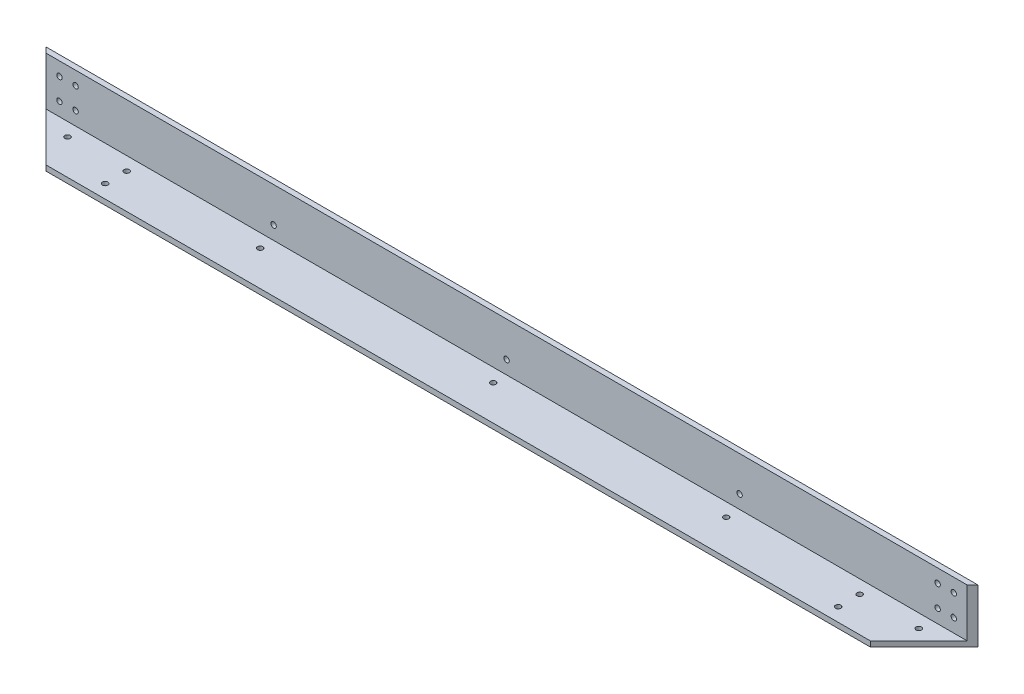
ISO-10303-21;
HEADER;
FILE_DESCRIPTION(('STEP AP214'),'2;1');
FILE_NAME('part.step','',(''),(''),'','','');
FILE_SCHEMA(('AUTOMOTIVE_DESIGN { 1 0 10303 214 1 1 1 1 }'));
ENDSEC;
DATA;
#1=APPLICATION_CONTEXT('core data for automotive mechanical design processes');
#2=APPLICATION_PROTOCOL_DEFINITION('international standard','automotive_design',2000,#1);
#3=PRODUCT_CONTEXT('',#1,'mechanical');
#4=PRODUCT('Part','Part','',(#3));
#5=PRODUCT_RELATED_PRODUCT_CATEGORY('part','',(#4));
#6=PRODUCT_DEFINITION_FORMATION('','',#4);
#7=PRODUCT_DEFINITION_CONTEXT('part definition',#1,'design');
#8=PRODUCT_DEFINITION('design','',#6,#7);
#9=PRODUCT_DEFINITION_SHAPE('','',#8);
#10=(LENGTH_UNIT() NAMED_UNIT(*) SI_UNIT(.MILLI.,.METRE.));
#11=(NAMED_UNIT(*) PLANE_ANGLE_UNIT() SI_UNIT($,.RADIAN.));
#12=(NAMED_UNIT(*) SI_UNIT($,.STERADIAN.) SOLID_ANGLE_UNIT());
#13=UNCERTAINTY_MEASURE_WITH_UNIT(LENGTH_MEASURE(1.E-05),#10,'distance_accuracy_value','');
#14=(GEOMETRIC_REPRESENTATION_CONTEXT(3) GLOBAL_UNCERTAINTY_ASSIGNED_CONTEXT((#13)) GLOBAL_UNIT_ASSIGNED_CONTEXT((#10,
#11,#12)) REPRESENTATION_CONTEXT('',''));
#15=CARTESIAN_POINT('',(0.,0.,0.));
#16=DIRECTION('',(0.,0.,1.));
#17=DIRECTION('',(1.,0.,0.));
#18=AXIS2_PLACEMENT_3D('',#15,#16,#17);
#19=CARTESIAN_POINT('',(550.,31.75,0.));
#20=DIRECTION('',(0.,0.,1.));
#21=DIRECTION('',(0.,-1.,0.));
#22=AXIS2_PLACEMENT_3D('',#19,#20,#21);
#23=PLANE('',#22);
#24=CARTESIAN_POINT('',(20.6375,11.1125,0.));
#25=DIRECTION('',(0.,0.,1.));
#26=DIRECTION('',(1.,0.,0.));
#27=AXIS2_PLACEMENT_3D('',#24,#25,#26);
#28=CIRCLE('',#27,1.5875);
#29=CARTESIAN_POINT('',(22.225,11.1125,0.));
#30=VERTEX_POINT('',#29);
#31=EDGE_CURVE('E305',#30,#30,#28,.T.);
#32=ORIENTED_EDGE('',*,*,#31,.T.);
#33=EDGE_LOOP('',(#32));
#34=FACE_BOUND('',#33,.T.);
#35=CARTESIAN_POINT('',(529.3625,11.1125,0.));
#36=DIRECTION('',(0.,0.,1.));
#37=DIRECTION('',(1.,0.,0.));
#38=AXIS2_PLACEMENT_3D('',#35,#36,#37);
#39=CIRCLE('',#38,1.58750000000005);
#40=CARTESIAN_POINT('',(530.95,11.1125,0.));
#41=VERTEX_POINT('',#40);
#42=EDGE_CURVE('E295',#41,#41,#39,.T.);
#43=ORIENTED_EDGE('',*,*,#42,.T.);
#44=EDGE_LOOP('',(#43));
#45=FACE_BOUND('',#44,.T.);
#46=CARTESIAN_POINT('',(538.8875,11.1125,0.));
#47=DIRECTION('',(0.,0.,1.));
#48=DIRECTION('',(1.,0.,0.));
#49=AXIS2_PLACEMENT_3D('',#46,#47,#48);
#50=CIRCLE('',#49,1.58750000000005);
#51=CARTESIAN_POINT('',(540.475,11.1125,0.));
#52=VERTEX_POINT('',#51);
#53=EDGE_CURVE('E296',#52,#52,#50,.T.);
#54=ORIENTED_EDGE('',*,*,#53,.T.);
#55=EDGE_LOOP('',(#54));
#56=FACE_BOUND('',#55,.T.);
#57=CARTESIAN_POINT('',(137.5,11.1125,0.));
#58=DIRECTION('',(0.,0.,1.));
#59=DIRECTION('',(1.,0.,0.));
#60=AXIS2_PLACEMENT_3D('',#57,#58,#59);
#61=CIRCLE('',#60,1.58749999999998);
#62=CARTESIAN_POINT('',(139.0875,11.1125,0.));
#63=VERTEX_POINT('',#62);
#64=EDGE_CURVE('E279',#63,#63,#61,.T.);
#65=ORIENTED_EDGE('',*,*,#64,.T.);
#66=EDGE_LOOP('',(#65));
#67=FACE_BOUND('',#66,.T.);
#68=CARTESIAN_POINT('',(11.1125,11.1125,0.));
#69=DIRECTION('',(0.,0.,1.));
#70=DIRECTION('',(1.,0.,0.));
#71=AXIS2_PLACEMENT_3D('',#68,#69,#70);
#72=CIRCLE('',#71,1.5875);
#73=CARTESIAN_POINT('',(12.7,11.1125,0.));
#74=VERTEX_POINT('',#73);
#75=EDGE_CURVE('E304',#74,#74,#72,.T.);
#76=ORIENTED_EDGE('',*,*,#75,.T.);
#77=EDGE_LOOP('',(#76));
#78=FACE_BOUND('',#77,.T.);
#79=CARTESIAN_POINT('',(20.6375,23.8125,0.));
#80=DIRECTION('',(0.,0.,1.));
#81=DIRECTION('',(1.,0.,0.));
#82=AXIS2_PLACEMENT_3D('',#79,#80,#81);
#83=CIRCLE('',#82,1.5875);
#84=CARTESIAN_POINT('',(22.225,23.8125,0.));
#85=VERTEX_POINT('',#84);
#86=EDGE_CURVE('E328',#85,#85,#83,.T.);
#87=ORIENTED_EDGE('',*,*,#86,.T.);
#88=EDGE_LOOP('',(#87));
#89=FACE_BOUND('',#88,.T.);
#90=CARTESIAN_POINT('',(529.3625,23.8125,0.));
#91=DIRECTION('',(0.,0.,1.));
#92=DIRECTION('',(1.,0.,0.));
#93=AXIS2_PLACEMENT_3D('',#90,#91,#92);
#94=CIRCLE('',#93,1.58750000000005);
#95=CARTESIAN_POINT('',(530.95,23.8125,0.));
#96=VERTEX_POINT('',#95);
#97=EDGE_CURVE('E322',#96,#96,#94,.T.);
#98=ORIENTED_EDGE('',*,*,#97,.T.);
#99=EDGE_LOOP('',(#98));
#100=FACE_BOUND('',#99,.T.);
#101=CARTESIAN_POINT('',(538.8875,23.8125,0.));
#102=DIRECTION('',(0.,0.,1.));
#103=DIRECTION('',(1.,0.,0.));
#104=AXIS2_PLACEMENT_3D('',#101,#102,#103);
#105=CIRCLE('',#104,1.58750000000005);
#106=CARTESIAN_POINT('',(540.475,23.8125,0.));
#107=VERTEX_POINT('',#106);
#108=EDGE_CURVE('E316',#107,#107,#105,.T.);
#109=ORIENTED_EDGE('',*,*,#108,.T.);
#110=EDGE_LOOP('',(#109));
#111=FACE_BOUND('',#110,.T.);
#112=CARTESIAN_POINT('',(275.,11.1125,0.));
#113=DIRECTION('',(0.,0.,1.));
#114=DIRECTION('',(1.,0.,0.));
#115=AXIS2_PLACEMENT_3D('',#112,#113,#114);
#116=CIRCLE('',#115,1.58750000000004);
#117=CARTESIAN_POINT('',(276.5875,11.1125,0.));
#118=VERTEX_POINT('',#117);
#119=EDGE_CURVE('E274',#118,#118,#116,.T.);
#120=ORIENTED_EDGE('',*,*,#119,.T.);
#121=EDGE_LOOP('',(#120));
#122=FACE_BOUND('',#121,.T.);
#123=CARTESIAN_POINT('',(412.5,11.1125,0.));
#124=DIRECTION('',(0.,0.,1.));
#125=DIRECTION('',(1.,0.,0.));
#126=AXIS2_PLACEMENT_3D('',#123,#124,#125);
#127=CIRCLE('',#126,1.58750000000004);
#128=CARTESIAN_POINT('',(414.0875,11.1125,0.));
#129=VERTEX_POINT('',#128);
#130=EDGE_CURVE('E289',#129,#129,#127,.T.);
#131=ORIENTED_EDGE('',*,*,#130,.T.);
#132=EDGE_LOOP('',(#131));
#133=FACE_BOUND('',#132,.T.);
#134=CARTESIAN_POINT('',(11.1125,23.8125,0.));
#135=DIRECTION('',(0.,0.,1.));
#136=DIRECTION('',(1.,0.,0.));
#137=AXIS2_PLACEMENT_3D('',#134,#135,#136);
#138=CIRCLE('',#137,1.5875);
#139=CARTESIAN_POINT('',(12.7,23.8125,0.));
#140=VERTEX_POINT('',#139);
#141=EDGE_CURVE('E336',#140,#140,#138,.T.);
#142=ORIENTED_EDGE('',*,*,#141,.T.);
#143=EDGE_LOOP('',(#142));
#144=FACE_BOUND('',#143,.T.);
#145=DIRECTION('',(0.,1.,0.));
#146=VECTOR('',#145,1.);
#147=CARTESIAN_POINT('',(0.,31.75,0.));
#148=LINE('',#147,#146);
#149=CARTESIAN_POINT('',(0.,0.,0.));
#150=VERTEX_POINT('',#149);
#151=CARTESIAN_POINT('',(0.,31.75,0.));
#152=VERTEX_POINT('',#151);
#153=EDGE_CURVE('E107',#150,#152,#148,.T.);
#154=ORIENTED_EDGE('',*,*,#153,.T.);
#155=DIRECTION('',(-1.,0.,0.));
#156=VECTOR('',#155,1.);
#157=CARTESIAN_POINT('',(550.,31.75,0.));
#158=LINE('',#157,#156);
#159=CARTESIAN_POINT('',(550.,31.75,0.));
#160=VERTEX_POINT('',#159);
#161=EDGE_CURVE('E93',#160,#152,#158,.T.);
#162=ORIENTED_EDGE('',*,*,#161,.F.);
#163=DIRECTION('',(0.,1.,0.));
#164=VECTOR('',#163,1.);
#165=CARTESIAN_POINT('',(550.,31.75,0.));
#166=LINE('',#165,#164);
#167=CARTESIAN_POINT('',(550.,0.,0.));
#168=VERTEX_POINT('',#167);
#169=EDGE_CURVE('E105',#168,#160,#166,.T.);
#170=ORIENTED_EDGE('',*,*,#169,.F.);
#171=DIRECTION('',(-1.,0.,0.));
#172=VECTOR('',#171,1.);
#173=CARTESIAN_POINT('',(550.,0.,0.));
#174=LINE('',#173,#172);
#175=EDGE_CURVE('E114',#168,#150,#174,.T.);
#176=ORIENTED_EDGE('',*,*,#175,.T.);
#177=EDGE_LOOP('',(#154,#162,#170,#176));
#178=FACE_BOUND('',#177,.T.);
#179=ADVANCED_FACE('F38',(#34,#45,#56,#67,#78,#89,#100,#111,#122,#133,#144,#178),#23,.F.);
#180=CARTESIAN_POINT('',(550.,31.75,3.17499999999997));
#181=DIRECTION('',(0.,-1.,0.));
#182=DIRECTION('',(0.,0.,-1.));
#183=AXIS2_PLACEMENT_3D('',#180,#181,#182);
#184=PLANE('',#183);
#185=ORIENTED_EDGE('',*,*,#161,.T.);
#186=DIRECTION('',(0.707106781186547,0.,0.707106781186548));
#187=VECTOR('',#186,1.);
#188=CARTESIAN_POINT('',(31.7499999999999,31.75,31.75));
#189=LINE('',#188,#187);
#190=CARTESIAN_POINT('',(3.17499999999993,31.75,3.17499999999997));
#191=VERTEX_POINT('',#190);
#192=EDGE_CURVE('E61',#152,#191,#189,.T.);
#193=ORIENTED_EDGE('',*,*,#192,.T.);
#194=DIRECTION('',(-1.,0.,0.));
#195=VECTOR('',#194,1.);
#196=CARTESIAN_POINT('',(550.,31.75,3.17499999999997));
#197=LINE('',#196,#195);
#198=CARTESIAN_POINT('',(546.825,31.75,3.17499999999997));
#199=VERTEX_POINT('',#198);
#200=EDGE_CURVE('E95',#199,#191,#197,.T.);
#201=ORIENTED_EDGE('',*,*,#200,.F.);
#202=DIRECTION('',(-0.707106781186548,0.,0.707106781186547));
#203=VECTOR('',#202,1.);
#204=CARTESIAN_POINT('',(550.,31.75,0.));
#205=LINE('',#204,#203);
#206=EDGE_CURVE('E90',#199,#160,#205,.F.);
#207=ORIENTED_EDGE('',*,*,#206,.T.);
#208=EDGE_LOOP('',(#185,#193,#201,#207));
#209=FACE_BOUND('',#208,.T.);
#210=ADVANCED_FACE('F92',(#209),#184,.F.);
#211=CARTESIAN_POINT('',(550.,3.17499999999996,3.175));
#212=DIRECTION('',(0.,0.,-1.));
#213=DIRECTION('',(0.,1.,0.));
#214=AXIS2_PLACEMENT_3D('',#211,#212,#213);
#215=PLANE('',#214);
#216=CARTESIAN_POINT('',(20.6375,11.1125,3.17500000000001));
#217=DIRECTION('',(0.,0.,1.));
#218=DIRECTION('',(1.,0.,0.));
#219=AXIS2_PLACEMENT_3D('',#216,#217,#218);
#220=CIRCLE('',#219,1.5875);
#221=CARTESIAN_POINT('',(22.225,11.1125,3.17500000000001));
#222=VERTEX_POINT('',#221);
#223=EDGE_CURVE('E301',#222,#222,#220,.T.);
#224=ORIENTED_EDGE('',*,*,#223,.F.);
#225=EDGE_LOOP('',(#224));
#226=FACE_BOUND('',#225,.T.);
#227=CARTESIAN_POINT('',(529.3625,11.1125,3.17500000000001));
#228=DIRECTION('',(0.,0.,1.));
#229=DIRECTION('',(1.,0.,0.));
#230=AXIS2_PLACEMENT_3D('',#227,#228,#229);
#231=CIRCLE('',#230,1.58750000000005);
#232=CARTESIAN_POINT('',(530.95,11.1125,3.17500000000001));
#233=VERTEX_POINT('',#232);
#234=EDGE_CURVE('E307',#233,#233,#231,.T.);
#235=ORIENTED_EDGE('',*,*,#234,.F.);
#236=EDGE_LOOP('',(#235));
#237=FACE_BOUND('',#236,.T.);
#238=CARTESIAN_POINT('',(538.8875,11.1125,3.17500000000001));
#239=DIRECTION('',(0.,0.,1.));
#240=DIRECTION('',(1.,0.,0.));
#241=AXIS2_PLACEMENT_3D('',#238,#239,#240);
#242=CIRCLE('',#241,1.58750000000005);
#243=CARTESIAN_POINT('',(540.475,11.1125,3.17500000000001));
#244=VERTEX_POINT('',#243);
#245=EDGE_CURVE('E292',#244,#244,#242,.T.);
#246=ORIENTED_EDGE('',*,*,#245,.F.);
#247=EDGE_LOOP('',(#246));
#248=FACE_BOUND('',#247,.T.);
#249=CARTESIAN_POINT('',(137.5,11.1125,3.17500000000001));
#250=DIRECTION('',(0.,0.,1.));
#251=DIRECTION('',(1.,0.,0.));
#252=AXIS2_PLACEMENT_3D('',#249,#250,#251);
#253=CIRCLE('',#252,1.58749999999998);
#254=CARTESIAN_POINT('',(139.0875,11.1125,3.17500000000001));
#255=VERTEX_POINT('',#254);
#256=EDGE_CURVE('E282',#255,#255,#253,.T.);
#257=ORIENTED_EDGE('',*,*,#256,.F.);
#258=EDGE_LOOP('',(#257));
#259=FACE_BOUND('',#258,.T.);
#260=CARTESIAN_POINT('',(11.1125,11.1125,3.17500000000001));
#261=DIRECTION('',(0.,0.,1.));
#262=DIRECTION('',(1.,0.,0.));
#263=AXIS2_PLACEMENT_3D('',#260,#261,#262);
#264=CIRCLE('',#263,1.5875);
#265=CARTESIAN_POINT('',(12.7,11.1125,3.17500000000001));
#266=VERTEX_POINT('',#265);
#267=EDGE_CURVE('E331',#266,#266,#264,.T.);
#268=ORIENTED_EDGE('',*,*,#267,.F.);
#269=EDGE_LOOP('',(#268));
#270=FACE_BOUND('',#269,.T.);
#271=CARTESIAN_POINT('',(20.6375,23.8125,3.17500000000001));
#272=DIRECTION('',(0.,0.,1.));
#273=DIRECTION('',(1.,0.,0.));
#274=AXIS2_PLACEMENT_3D('',#271,#272,#273);
#275=CIRCLE('',#274,1.5875);
#276=CARTESIAN_POINT('',(22.225,23.8125,3.17500000000001));
#277=VERTEX_POINT('',#276);
#278=EDGE_CURVE('E325',#277,#277,#275,.T.);
#279=ORIENTED_EDGE('',*,*,#278,.F.);
#280=EDGE_LOOP('',(#279));
#281=FACE_BOUND('',#280,.T.);
#282=CARTESIAN_POINT('',(529.3625,23.8125,3.17500000000001));
#283=DIRECTION('',(0.,0.,1.));
#284=DIRECTION('',(1.,0.,0.));
#285=AXIS2_PLACEMENT_3D('',#282,#283,#284);
#286=CIRCLE('',#285,1.58750000000005);
#287=CARTESIAN_POINT('',(530.95,23.8125,3.17500000000001));
#288=VERTEX_POINT('',#287);
#289=EDGE_CURVE('E319',#288,#288,#286,.T.);
#290=ORIENTED_EDGE('',*,*,#289,.F.);
#291=EDGE_LOOP('',(#290));
#292=FACE_BOUND('',#291,.T.);
#293=CARTESIAN_POINT('',(538.8875,23.8125,3.17500000000001));
#294=DIRECTION('',(0.,0.,1.));
#295=DIRECTION('',(1.,0.,0.));
#296=AXIS2_PLACEMENT_3D('',#293,#294,#295);
#297=CIRCLE('',#296,1.58750000000005);
#298=CARTESIAN_POINT('',(540.475,23.8125,3.17500000000001));
#299=VERTEX_POINT('',#298);
#300=EDGE_CURVE('E312',#299,#299,#297,.T.);
#301=ORIENTED_EDGE('',*,*,#300,.F.);
#302=EDGE_LOOP('',(#301));
#303=FACE_BOUND('',#302,.T.);
#304=CARTESIAN_POINT('',(275.,11.1125,3.17500000000001));
#305=DIRECTION('',(0.,0.,1.));
#306=DIRECTION('',(1.,0.,0.));
#307=AXIS2_PLACEMENT_3D('',#304,#305,#306);
#308=CIRCLE('',#307,1.58750000000004);
#309=CARTESIAN_POINT('',(276.5875,11.1125,3.17500000000001));
#310=VERTEX_POINT('',#309);
#311=EDGE_CURVE('E277',#310,#310,#308,.T.);
#312=ORIENTED_EDGE('',*,*,#311,.F.);
#313=EDGE_LOOP('',(#312));
#314=FACE_BOUND('',#313,.T.);
#315=CARTESIAN_POINT('',(412.5,11.1125,3.17500000000001));
#316=DIRECTION('',(0.,0.,1.));
#317=DIRECTION('',(1.,0.,0.));
#318=AXIS2_PLACEMENT_3D('',#315,#316,#317);
#319=CIRCLE('',#318,1.58750000000004);
#320=CARTESIAN_POINT('',(414.0875,11.1125,3.17500000000001));
#321=VERTEX_POINT('',#320);
#322=EDGE_CURVE('E284',#321,#321,#319,.T.);
#323=ORIENTED_EDGE('',*,*,#322,.F.);
#324=EDGE_LOOP('',(#323));
#325=FACE_BOUND('',#324,.T.);
#326=CARTESIAN_POINT('',(11.1125,23.8125,3.17500000000001));
#327=DIRECTION('',(0.,0.,1.));
#328=DIRECTION('',(1.,0.,0.));
#329=AXIS2_PLACEMENT_3D('',#326,#327,#328);
#330=CIRCLE('',#329,1.5875);
#331=CARTESIAN_POINT('',(12.7,23.8125,3.17500000000001));
#332=VERTEX_POINT('',#331);
#333=EDGE_CURVE('E315',#332,#332,#330,.T.);
#334=ORIENTED_EDGE('',*,*,#333,.F.);
#335=EDGE_LOOP('',(#334));
#336=FACE_BOUND('',#335,.T.);
#337=ORIENTED_EDGE('',*,*,#200,.T.);
#338=DIRECTION('',(0.,-1.,0.));
#339=VECTOR('',#338,1.);
#340=CARTESIAN_POINT('',(3.17500000000003,0.,3.17500000000001));
#341=LINE('',#340,#339);
#342=CARTESIAN_POINT('',(3.17500000000004,3.17499999999996,3.175));
#343=VERTEX_POINT('',#342);
#344=EDGE_CURVE('E47',#191,#343,#341,.T.);
#345=ORIENTED_EDGE('',*,*,#344,.T.);
#346=DIRECTION('',(-1.,0.,0.));
#347=VECTOR('',#346,1.);
#348=CARTESIAN_POINT('',(550.,3.17499999999996,3.175));
#349=LINE('',#348,#347);
#350=CARTESIAN_POINT('',(546.825,3.17499999999996,3.175));
#351=VERTEX_POINT('',#350);
#352=EDGE_CURVE('E129',#351,#343,#349,.T.);
#353=ORIENTED_EDGE('',*,*,#352,.F.);
#354=DIRECTION('',(0.,-1.,0.));
#355=VECTOR('',#354,1.);
#356=CARTESIAN_POINT('',(546.825,0.,3.17500000000001));
#357=LINE('',#356,#355);
#358=EDGE_CURVE('E100',#351,#199,#357,.F.);
#359=ORIENTED_EDGE('',*,*,#358,.T.);
#360=EDGE_LOOP('',(#337,#345,#353,#359));
#361=FACE_BOUND('',#360,.T.);
#362=ADVANCED_FACE('F153',(#226,#237,#248,#259,#270,#281,#292,#303,#314,#325,#336,#361),#215,.F.);
#363=CARTESIAN_POINT('',(550.,3.17499999999996,31.75));
#364=DIRECTION('',(0.,-1.,0.));
#365=DIRECTION('',(0.,0.,-1.));
#366=AXIS2_PLACEMENT_3D('',#363,#364,#365);
#367=PLANE('',#366);
#368=CARTESIAN_POINT('',(275.,3.17499999999996,11.1125));
#369=DIRECTION('',(0.,1.,0.));
#370=DIRECTION('',(0.,0.,1.));
#371=AXIS2_PLACEMENT_3D('',#368,#369,#370);
#372=CIRCLE('',#371,1.58750000000004);
#373=CARTESIAN_POINT('',(275.,3.17499999999996,12.7));
#374=VERTEX_POINT('',#373);
#375=EDGE_CURVE('E366',#374,#374,#372,.T.);
#376=ORIENTED_EDGE('',*,*,#375,.F.);
#377=EDGE_LOOP('',(#376));
#378=FACE_BOUND('',#377,.T.);
#379=CARTESIAN_POINT('',(412.5,3.17499999999996,11.1125));
#380=DIRECTION('',(0.,1.,0.));
#381=DIRECTION('',(0.,0.,1.));
#382=AXIS2_PLACEMENT_3D('',#379,#380,#381);
#383=CIRCLE('',#382,1.58750000000004);
#384=CARTESIAN_POINT('',(412.5,3.17499999999996,12.7));
#385=VERTEX_POINT('',#384);
#386=EDGE_CURVE('E371',#385,#385,#383,.T.);
#387=ORIENTED_EDGE('',*,*,#386,.F.);
#388=EDGE_LOOP('',(#387));
#389=FACE_BOUND('',#388,.T.);
#390=CARTESIAN_POINT('',(491.2625,3.17499999999996,23.8125));
#391=DIRECTION('',(0.,1.,0.));
#392=DIRECTION('',(0.,0.,1.));
#393=AXIS2_PLACEMENT_3D('',#390,#391,#392);
#394=CIRCLE('',#393,1.58750000000004);
#395=CARTESIAN_POINT('',(491.2625,3.17499999999996,25.4));
#396=VERTEX_POINT('',#395);
#397=EDGE_CURVE('E377',#396,#396,#394,.T.);
#398=ORIENTED_EDGE('',*,*,#397,.F.);
#399=EDGE_LOOP('',(#398));
#400=FACE_BOUND('',#399,.T.);
#401=CARTESIAN_POINT('',(491.2625,3.17499999999996,11.1125));
#402=DIRECTION('',(0.,1.,0.));
#403=DIRECTION('',(0.,0.,1.));
#404=AXIS2_PLACEMENT_3D('',#401,#402,#403);
#405=CIRCLE('',#404,1.58750000000004);
#406=CARTESIAN_POINT('',(491.2625,3.17499999999996,12.7));
#407=VERTEX_POINT('',#406);
#408=EDGE_CURVE('E383',#407,#407,#405,.T.);
#409=ORIENTED_EDGE('',*,*,#408,.F.);
#410=EDGE_LOOP('',(#409));
#411=FACE_BOUND('',#410,.T.);
#412=CARTESIAN_POINT('',(23.8125,3.17499999999996,11.1125));
#413=DIRECTION('',(0.,1.,0.));
#414=DIRECTION('',(0.,0.,1.));
#415=AXIS2_PLACEMENT_3D('',#412,#413,#414);
#416=CIRCLE('',#415,1.5875);
#417=CARTESIAN_POINT('',(23.8125,3.17499999999996,12.7));
#418=VERTEX_POINT('',#417);
#419=EDGE_CURVE('E349',#418,#418,#416,.T.);
#420=ORIENTED_EDGE('',*,*,#419,.F.);
#421=EDGE_LOOP('',(#420));
#422=FACE_BOUND('',#421,.T.);
#423=CARTESIAN_POINT('',(526.1875,3.17499999999996,11.1125));
#424=DIRECTION('',(0.,1.,0.));
#425=DIRECTION('',(0.,0.,1.));
#426=AXIS2_PLACEMENT_3D('',#423,#424,#425);
#427=CIRCLE('',#426,1.58750000000005);
#428=CARTESIAN_POINT('',(526.1875,3.17499999999996,12.7));
#429=VERTEX_POINT('',#428);
#430=EDGE_CURVE('E342',#429,#429,#427,.T.);
#431=ORIENTED_EDGE('',*,*,#430,.F.);
#432=EDGE_LOOP('',(#431));
#433=FACE_BOUND('',#432,.T.);
#434=CARTESIAN_POINT('',(58.7375,3.17499999999996,11.1125));
#435=DIRECTION('',(0.,1.,0.));
#436=DIRECTION('',(0.,0.,1.));
#437=AXIS2_PLACEMENT_3D('',#434,#435,#436);
#438=CIRCLE('',#437,1.5875);
#439=CARTESIAN_POINT('',(58.7375,3.17499999999996,12.7));
#440=VERTEX_POINT('',#439);
#441=EDGE_CURVE('E361',#440,#440,#438,.T.);
#442=ORIENTED_EDGE('',*,*,#441,.F.);
#443=EDGE_LOOP('',(#442));
#444=FACE_BOUND('',#443,.T.);
#445=CARTESIAN_POINT('',(58.7375,3.17499999999996,23.8125));
#446=DIRECTION('',(0.,1.,0.));
#447=DIRECTION('',(0.,0.,1.));
#448=AXIS2_PLACEMENT_3D('',#445,#446,#447);
#449=CIRCLE('',#448,1.58749999999998);
#450=CARTESIAN_POINT('',(58.7375,3.17499999999996,25.4));
#451=VERTEX_POINT('',#450);
#452=EDGE_CURVE('E354',#451,#451,#449,.T.);
#453=ORIENTED_EDGE('',*,*,#452,.F.);
#454=EDGE_LOOP('',(#453));
#455=FACE_BOUND('',#454,.T.);
#456=CARTESIAN_POINT('',(137.5,3.17499999999996,11.1125));
#457=DIRECTION('',(0.,1.,0.));
#458=DIRECTION('',(0.,0.,1.));
#459=AXIS2_PLACEMENT_3D('',#456,#457,#458);
#460=CIRCLE('',#459,1.58749999999998);
#461=CARTESIAN_POINT('',(137.5,3.17499999999996,12.7));
#462=VERTEX_POINT('',#461);
#463=EDGE_CURVE('E121',#462,#462,#460,.T.);
#464=ORIENTED_EDGE('',*,*,#463,.F.);
#465=EDGE_LOOP('',(#464));
#466=FACE_BOUND('',#465,.T.);
#467=ORIENTED_EDGE('',*,*,#352,.T.);
#468=DIRECTION('',(0.707106781186547,0.,0.707106781186548));
#469=VECTOR('',#468,1.);
#470=CARTESIAN_POINT('',(31.7499999999999,3.17499999999996,31.75));
#471=LINE('',#470,#469);
#472=CARTESIAN_POINT('',(31.7499999999999,3.17499999999996,31.75));
#473=VERTEX_POINT('',#472);
#474=EDGE_CURVE('E11',#343,#473,#471,.T.);
#475=ORIENTED_EDGE('',*,*,#474,.T.);
#476=DIRECTION('',(-1.,0.,0.));
#477=VECTOR('',#476,1.);
#478=CARTESIAN_POINT('',(550.,3.17499999999996,31.75));
#479=LINE('',#478,#477);
#480=CARTESIAN_POINT('',(518.25,3.17499999999996,31.75));
#481=VERTEX_POINT('',#480);
#482=EDGE_CURVE('E126',#481,#473,#479,.T.);
#483=ORIENTED_EDGE('',*,*,#482,.F.);
#484=DIRECTION('',(-0.707106781186548,0.,0.707106781186547));
#485=VECTOR('',#484,1.);
#486=CARTESIAN_POINT('',(550.,3.17499999999996,0.));
#487=LINE('',#486,#485);
#488=EDGE_CURVE('E135',#481,#351,#487,.F.);
#489=ORIENTED_EDGE('',*,*,#488,.T.);
#490=EDGE_LOOP('',(#467,#475,#483,#489));
#491=FACE_BOUND('',#490,.T.);
#492=ADVANCED_FACE('F150',(#378,#389,#400,#411,#422,#433,#444,#455,#466,#491),#367,.F.);
#493=CARTESIAN_POINT('',(550.,0.,31.75));
#494=DIRECTION('',(0.,0.,-1.));
#495=DIRECTION('',(-1.,0.,0.));
#496=AXIS2_PLACEMENT_3D('',#493,#494,#495);
#497=PLANE('',#496);
#498=ORIENTED_EDGE('',*,*,#482,.T.);
#499=DIRECTION('',(0.,-1.,0.));
#500=VECTOR('',#499,1.);
#501=CARTESIAN_POINT('',(31.7499999999999,0.,31.75));
#502=LINE('',#501,#500);
#503=CARTESIAN_POINT('',(31.7499999999999,0.,31.75));
#504=VERTEX_POINT('',#503);
#505=EDGE_CURVE('E99',#473,#504,#502,.T.);
#506=ORIENTED_EDGE('',*,*,#505,.T.);
#507=DIRECTION('',(-1.,0.,0.));
#508=VECTOR('',#507,1.);
#509=CARTESIAN_POINT('',(550.,0.,31.75));
#510=LINE('',#509,#508);
#511=CARTESIAN_POINT('',(518.25,0.,31.75));
#512=VERTEX_POINT('',#511);
#513=EDGE_CURVE('E116',#512,#504,#510,.T.);
#514=ORIENTED_EDGE('',*,*,#513,.F.);
#515=DIRECTION('',(0.,1.,0.));
#516=VECTOR('',#515,1.);
#517=CARTESIAN_POINT('',(518.25,0.,31.75));
#518=LINE('',#517,#516);
#519=EDGE_CURVE('E133',#512,#481,#518,.T.);
#520=ORIENTED_EDGE('',*,*,#519,.T.);
#521=EDGE_LOOP('',(#498,#506,#514,#520));
#522=FACE_BOUND('',#521,.T.);
#523=ADVANCED_FACE('F152',(#522),#497,.F.);
#524=CARTESIAN_POINT('',(550.,0.,0.));
#525=DIRECTION('',(0.,1.,0.));
#526=DIRECTION('',(0.,0.,1.));
#527=AXIS2_PLACEMENT_3D('',#524,#525,#526);
#528=PLANE('',#527);
#529=CARTESIAN_POINT('',(275.,0.,11.1125));
#530=DIRECTION('',(0.,1.,0.));
#531=DIRECTION('',(0.,0.,1.));
#532=AXIS2_PLACEMENT_3D('',#529,#530,#531);
#533=CIRCLE('',#532,1.58750000000004);
#534=CARTESIAN_POINT('',(275.,0.,12.7));
#535=VERTEX_POINT('',#534);
#536=EDGE_CURVE('E369',#535,#535,#533,.T.);
#537=ORIENTED_EDGE('',*,*,#536,.T.);
#538=EDGE_LOOP('',(#537));
#539=FACE_BOUND('',#538,.T.);
#540=CARTESIAN_POINT('',(412.5,0.,11.1125));
#541=DIRECTION('',(0.,1.,0.));
#542=DIRECTION('',(0.,0.,1.));
#543=AXIS2_PLACEMENT_3D('',#540,#541,#542);
#544=CIRCLE('',#543,1.58750000000004);
#545=CARTESIAN_POINT('',(412.5,0.,12.7));
#546=VERTEX_POINT('',#545);
#547=EDGE_CURVE('E374',#546,#546,#544,.T.);
#548=ORIENTED_EDGE('',*,*,#547,.T.);
#549=EDGE_LOOP('',(#548));
#550=FACE_BOUND('',#549,.T.);
#551=CARTESIAN_POINT('',(491.2625,0.,23.8125));
#552=DIRECTION('',(0.,1.,0.));
#553=DIRECTION('',(0.,0.,1.));
#554=AXIS2_PLACEMENT_3D('',#551,#552,#553);
#555=CIRCLE('',#554,1.58750000000004);
#556=CARTESIAN_POINT('',(491.2625,0.,25.4));
#557=VERTEX_POINT('',#556);
#558=EDGE_CURVE('E380',#557,#557,#555,.T.);
#559=ORIENTED_EDGE('',*,*,#558,.T.);
#560=EDGE_LOOP('',(#559));
#561=FACE_BOUND('',#560,.T.);
#562=CARTESIAN_POINT('',(491.2625,0.,11.1125));
#563=DIRECTION('',(0.,1.,0.));
#564=DIRECTION('',(0.,0.,1.));
#565=AXIS2_PLACEMENT_3D('',#562,#563,#564);
#566=CIRCLE('',#565,1.58750000000004);
#567=CARTESIAN_POINT('',(491.2625,0.,12.7));
#568=VERTEX_POINT('',#567);
#569=EDGE_CURVE('E357',#568,#568,#566,.T.);
#570=ORIENTED_EDGE('',*,*,#569,.T.);
#571=EDGE_LOOP('',(#570));
#572=FACE_BOUND('',#571,.T.);
#573=CARTESIAN_POINT('',(23.8125,0.,11.1125));
#574=DIRECTION('',(0.,1.,0.));
#575=DIRECTION('',(0.,0.,1.));
#576=AXIS2_PLACEMENT_3D('',#573,#574,#575);
#577=CIRCLE('',#576,1.5875);
#578=CARTESIAN_POINT('',(23.8125,0.,12.7));
#579=VERTEX_POINT('',#578);
#580=EDGE_CURVE('E339',#579,#579,#577,.T.);
#581=ORIENTED_EDGE('',*,*,#580,.T.);
#582=EDGE_LOOP('',(#581));
#583=FACE_BOUND('',#582,.T.);
#584=CARTESIAN_POINT('',(526.1875,0.,11.1125));
#585=DIRECTION('',(0.,1.,0.));
#586=DIRECTION('',(0.,0.,1.));
#587=AXIS2_PLACEMENT_3D('',#584,#585,#586);
#588=CIRCLE('',#587,1.58750000000005);
#589=CARTESIAN_POINT('',(526.1875,0.,12.7));
#590=VERTEX_POINT('',#589);
#591=EDGE_CURVE('E346',#590,#590,#588,.T.);
#592=ORIENTED_EDGE('',*,*,#591,.T.);
#593=EDGE_LOOP('',(#592));
#594=FACE_BOUND('',#593,.T.);
#595=CARTESIAN_POINT('',(58.7375,0.,11.1125));
#596=DIRECTION('',(0.,1.,0.));
#597=DIRECTION('',(0.,0.,1.));
#598=AXIS2_PLACEMENT_3D('',#595,#596,#597);
#599=CIRCLE('',#598,1.5875);
#600=CARTESIAN_POINT('',(58.7375,0.,12.7));
#601=VERTEX_POINT('',#600);
#602=EDGE_CURVE('E345',#601,#601,#599,.T.);
#603=ORIENTED_EDGE('',*,*,#602,.T.);
#604=EDGE_LOOP('',(#603));
#605=FACE_BOUND('',#604,.T.);
#606=CARTESIAN_POINT('',(58.7375,0.,23.8125));
#607=DIRECTION('',(0.,1.,0.));
#608=DIRECTION('',(0.,0.,1.));
#609=AXIS2_PLACEMENT_3D('',#606,#607,#608);
#610=CIRCLE('',#609,1.58749999999998);
#611=CARTESIAN_POINT('',(58.7375,0.,25.4));
#612=VERTEX_POINT('',#611);
#613=EDGE_CURVE('E358',#612,#612,#610,.T.);
#614=ORIENTED_EDGE('',*,*,#613,.T.);
#615=EDGE_LOOP('',(#614));
#616=FACE_BOUND('',#615,.T.);
#617=CARTESIAN_POINT('',(137.5,0.,11.1125));
#618=DIRECTION('',(0.,1.,0.));
#619=DIRECTION('',(0.,0.,1.));
#620=AXIS2_PLACEMENT_3D('',#617,#618,#619);
#621=CIRCLE('',#620,1.58749999999998);
#622=CARTESIAN_POINT('',(137.5,0.,12.7));
#623=VERTEX_POINT('',#622);
#624=EDGE_CURVE('E118',#623,#623,#621,.T.);
#625=ORIENTED_EDGE('',*,*,#624,.T.);
#626=EDGE_LOOP('',(#625));
#627=FACE_BOUND('',#626,.T.);
#628=ORIENTED_EDGE('',*,*,#513,.T.);
#629=DIRECTION('',(-0.707106781186547,0.,-0.707106781186548));
#630=VECTOR('',#629,1.);
#631=CARTESIAN_POINT('',(31.7499999999999,0.,31.75));
#632=LINE('',#631,#630);
#633=EDGE_CURVE('E140',#504,#150,#632,.T.);
#634=ORIENTED_EDGE('',*,*,#633,.T.);
#635=ORIENTED_EDGE('',*,*,#175,.F.);
#636=DIRECTION('',(0.707106781186548,0.,-0.707106781186547));
#637=VECTOR('',#636,1.);
#638=CARTESIAN_POINT('',(550.,0.,0.));
#639=LINE('',#638,#637);
#640=EDGE_CURVE('E108',#168,#512,#639,.F.);
#641=ORIENTED_EDGE('',*,*,#640,.T.);
#642=EDGE_LOOP('',(#628,#634,#635,#641));
#643=FACE_BOUND('',#642,.T.);
#644=ADVANCED_FACE('F143',(#539,#550,#561,#572,#583,#594,#605,#616,#627,#643),#528,.F.);
#645=CARTESIAN_POINT('',(550.,0.,0.));
#646=DIRECTION('',(-0.707106781186547,0.,-0.707106781186548));
#647=DIRECTION('',(0.,-1.,0.));
#648=AXIS2_PLACEMENT_3D('',#645,#646,#647);
#649=PLANE('',#648);
#650=ORIENTED_EDGE('',*,*,#488,.F.);
#651=ORIENTED_EDGE('',*,*,#519,.F.);
#652=ORIENTED_EDGE('',*,*,#640,.F.);
#653=ORIENTED_EDGE('',*,*,#169,.T.);
#654=ORIENTED_EDGE('',*,*,#206,.F.);
#655=ORIENTED_EDGE('',*,*,#358,.F.);
#656=EDGE_LOOP('',(#650,#651,#652,#653,#654,#655));
#657=FACE_BOUND('',#656,.T.);
#658=ADVANCED_FACE('F111',(#657),#649,.F.);
#659=CARTESIAN_POINT('',(31.7499999999999,0.,31.75));
#660=DIRECTION('',(-0.707106781186548,0.,0.707106781186547));
#661=DIRECTION('',(0.,1.,0.));
#662=AXIS2_PLACEMENT_3D('',#659,#660,#661);
#663=PLANE('',#662);
#664=ORIENTED_EDGE('',*,*,#192,.F.);
#665=ORIENTED_EDGE('',*,*,#153,.F.);
#666=ORIENTED_EDGE('',*,*,#633,.F.);
#667=ORIENTED_EDGE('',*,*,#505,.F.);
#668=ORIENTED_EDGE('',*,*,#474,.F.);
#669=ORIENTED_EDGE('',*,*,#344,.F.);
#670=EDGE_LOOP('',(#664,#665,#666,#667,#668,#669));
#671=FACE_BOUND('',#670,.T.);
#672=ADVANCED_FACE('F41',(#671),#663,.T.);
#673=CARTESIAN_POINT('',(137.5,0.,11.1125));
#674=DIRECTION('',(0.,1.,0.));
#675=DIRECTION('',(0.,0.,1.));
#676=AXIS2_PLACEMENT_3D('',#673,#674,#675);
#677=CYLINDRICAL_SURFACE('',#676,1.58749999999998);
#678=ORIENTED_EDGE('',*,*,#624,.F.);
#679=EDGE_LOOP('',(#678));
#680=FACE_BOUND('',#679,.T.);
#681=ORIENTED_EDGE('',*,*,#463,.T.);
#682=EDGE_LOOP('',(#681));
#683=FACE_BOUND('',#682,.T.);
#684=ADVANCED_FACE('F181',(#680,#683),#677,.F.);
#685=CARTESIAN_POINT('',(58.7375,0.,23.8125));
#686=DIRECTION('',(0.,1.,0.));
#687=DIRECTION('',(0.,0.,1.));
#688=AXIS2_PLACEMENT_3D('',#685,#686,#687);
#689=CYLINDRICAL_SURFACE('',#688,1.58749999999998);
#690=ORIENTED_EDGE('',*,*,#613,.F.);
#691=EDGE_LOOP('',(#690));
#692=FACE_BOUND('',#691,.T.);
#693=ORIENTED_EDGE('',*,*,#452,.T.);
#694=EDGE_LOOP('',(#693));
#695=FACE_BOUND('',#694,.T.);
#696=ADVANCED_FACE('F193',(#692,#695),#689,.F.);
#697=CARTESIAN_POINT('',(58.7375,0.,11.1125));
#698=DIRECTION('',(0.,1.,0.));
#699=DIRECTION('',(0.,0.,1.));
#700=AXIS2_PLACEMENT_3D('',#697,#698,#699);
#701=CYLINDRICAL_SURFACE('',#700,1.5875);
#702=ORIENTED_EDGE('',*,*,#602,.F.);
#703=EDGE_LOOP('',(#702));
#704=FACE_BOUND('',#703,.T.);
#705=ORIENTED_EDGE('',*,*,#441,.T.);
#706=EDGE_LOOP('',(#705));
#707=FACE_BOUND('',#706,.T.);
#708=ADVANCED_FACE('F213',(#704,#707),#701,.F.);
#709=CARTESIAN_POINT('',(526.1875,0.,11.1125));
#710=DIRECTION('',(0.,1.,0.));
#711=DIRECTION('',(0.,0.,1.));
#712=AXIS2_PLACEMENT_3D('',#709,#710,#711);
#713=CYLINDRICAL_SURFACE('',#712,1.58750000000005);
#714=ORIENTED_EDGE('',*,*,#591,.F.);
#715=EDGE_LOOP('',(#714));
#716=FACE_BOUND('',#715,.T.);
#717=ORIENTED_EDGE('',*,*,#430,.T.);
#718=EDGE_LOOP('',(#717));
#719=FACE_BOUND('',#718,.T.);
#720=ADVANCED_FACE('F216',(#716,#719),#713,.F.);
#721=CARTESIAN_POINT('',(23.8125,0.,11.1125));
#722=DIRECTION('',(0.,1.,0.));
#723=DIRECTION('',(0.,0.,1.));
#724=AXIS2_PLACEMENT_3D('',#721,#722,#723);
#725=CYLINDRICAL_SURFACE('',#724,1.5875);
#726=ORIENTED_EDGE('',*,*,#580,.F.);
#727=EDGE_LOOP('',(#726));
#728=FACE_BOUND('',#727,.T.);
#729=ORIENTED_EDGE('',*,*,#419,.T.);
#730=EDGE_LOOP('',(#729));
#731=FACE_BOUND('',#730,.T.);
#732=ADVANCED_FACE('F199',(#728,#731),#725,.F.);
#733=CARTESIAN_POINT('',(491.2625,0.,11.1125));
#734=DIRECTION('',(0.,1.,0.));
#735=DIRECTION('',(0.,0.,1.));
#736=AXIS2_PLACEMENT_3D('',#733,#734,#735);
#737=CYLINDRICAL_SURFACE('',#736,1.58750000000004);
#738=ORIENTED_EDGE('',*,*,#569,.F.);
#739=EDGE_LOOP('',(#738));
#740=FACE_BOUND('',#739,.T.);
#741=ORIENTED_EDGE('',*,*,#408,.T.);
#742=EDGE_LOOP('',(#741));
#743=FACE_BOUND('',#742,.T.);
#744=ADVANCED_FACE('F195',(#740,#743),#737,.F.);
#745=CARTESIAN_POINT('',(491.2625,0.,23.8125));
#746=DIRECTION('',(0.,1.,0.));
#747=DIRECTION('',(0.,0.,1.));
#748=AXIS2_PLACEMENT_3D('',#745,#746,#747);
#749=CYLINDRICAL_SURFACE('',#748,1.58750000000004);
#750=ORIENTED_EDGE('',*,*,#558,.F.);
#751=EDGE_LOOP('',(#750));
#752=FACE_BOUND('',#751,.T.);
#753=ORIENTED_EDGE('',*,*,#397,.T.);
#754=EDGE_LOOP('',(#753));
#755=FACE_BOUND('',#754,.T.);
#756=ADVANCED_FACE('F198',(#752,#755),#749,.F.);
#757=CARTESIAN_POINT('',(412.5,0.,11.1125));
#758=DIRECTION('',(0.,1.,0.));
#759=DIRECTION('',(0.,0.,1.));
#760=AXIS2_PLACEMENT_3D('',#757,#758,#759);
#761=CYLINDRICAL_SURFACE('',#760,1.58750000000004);
#762=ORIENTED_EDGE('',*,*,#547,.F.);
#763=EDGE_LOOP('',(#762));
#764=FACE_BOUND('',#763,.T.);
#765=ORIENTED_EDGE('',*,*,#386,.T.);
#766=EDGE_LOOP('',(#765));
#767=FACE_BOUND('',#766,.T.);
#768=ADVANCED_FACE('F203',(#764,#767),#761,.F.);
#769=CARTESIAN_POINT('',(275.,0.,11.1125));
#770=DIRECTION('',(0.,1.,0.));
#771=DIRECTION('',(0.,0.,1.));
#772=AXIS2_PLACEMENT_3D('',#769,#770,#771);
#773=CYLINDRICAL_SURFACE('',#772,1.58750000000004);
#774=ORIENTED_EDGE('',*,*,#536,.F.);
#775=EDGE_LOOP('',(#774));
#776=FACE_BOUND('',#775,.T.);
#777=ORIENTED_EDGE('',*,*,#375,.T.);
#778=EDGE_LOOP('',(#777));
#779=FACE_BOUND('',#778,.T.);
#780=ADVANCED_FACE('F207',(#776,#779),#773,.F.);
#781=CARTESIAN_POINT('',(11.1125,23.8125,0.));
#782=DIRECTION('',(0.,0.,1.));
#783=DIRECTION('',(1.,0.,0.));
#784=AXIS2_PLACEMENT_3D('',#781,#782,#783);
#785=CYLINDRICAL_SURFACE('',#784,1.5875);
#786=ORIENTED_EDGE('',*,*,#141,.F.);
#787=EDGE_LOOP('',(#786));
#788=FACE_BOUND('',#787,.T.);
#789=ORIENTED_EDGE('',*,*,#333,.T.);
#790=EDGE_LOOP('',(#789));
#791=FACE_BOUND('',#790,.T.);
#792=ADVANCED_FACE('F211',(#788,#791),#785,.F.);
#793=CARTESIAN_POINT('',(412.5,11.1125,0.));
#794=DIRECTION('',(0.,0.,1.));
#795=DIRECTION('',(1.,0.,0.));
#796=AXIS2_PLACEMENT_3D('',#793,#794,#795);
#797=CYLINDRICAL_SURFACE('',#796,1.58750000000004);
#798=ORIENTED_EDGE('',*,*,#130,.F.);
#799=EDGE_LOOP('',(#798));
#800=FACE_BOUND('',#799,.T.);
#801=ORIENTED_EDGE('',*,*,#322,.T.);
#802=EDGE_LOOP('',(#801));
#803=FACE_BOUND('',#802,.T.);
#804=ADVANCED_FACE('F229',(#800,#803),#797,.F.);
#805=CARTESIAN_POINT('',(275.,11.1125,0.));
#806=DIRECTION('',(0.,0.,1.));
#807=DIRECTION('',(1.,0.,0.));
#808=AXIS2_PLACEMENT_3D('',#805,#806,#807);
#809=CYLINDRICAL_SURFACE('',#808,1.58750000000004);
#810=ORIENTED_EDGE('',*,*,#119,.F.);
#811=EDGE_LOOP('',(#810));
#812=FACE_BOUND('',#811,.T.);
#813=ORIENTED_EDGE('',*,*,#311,.T.);
#814=EDGE_LOOP('',(#813));
#815=FACE_BOUND('',#814,.T.);
#816=ADVANCED_FACE('F247',(#812,#815),#809,.F.);
#817=CARTESIAN_POINT('',(538.8875,23.8125,0.));
#818=DIRECTION('',(0.,0.,1.));
#819=DIRECTION('',(1.,0.,0.));
#820=AXIS2_PLACEMENT_3D('',#817,#818,#819);
#821=CYLINDRICAL_SURFACE('',#820,1.58750000000005);
#822=ORIENTED_EDGE('',*,*,#108,.F.);
#823=EDGE_LOOP('',(#822));
#824=FACE_BOUND('',#823,.T.);
#825=ORIENTED_EDGE('',*,*,#300,.T.);
#826=EDGE_LOOP('',(#825));
#827=FACE_BOUND('',#826,.T.);
#828=ADVANCED_FACE('F243',(#824,#827),#821,.F.);
#829=CARTESIAN_POINT('',(529.3625,23.8125,0.));
#830=DIRECTION('',(0.,0.,1.));
#831=DIRECTION('',(1.,0.,0.));
#832=AXIS2_PLACEMENT_3D('',#829,#830,#831);
#833=CYLINDRICAL_SURFACE('',#832,1.58750000000005);
#834=ORIENTED_EDGE('',*,*,#97,.F.);
#835=EDGE_LOOP('',(#834));
#836=FACE_BOUND('',#835,.T.);
#837=ORIENTED_EDGE('',*,*,#289,.T.);
#838=EDGE_LOOP('',(#837));
#839=FACE_BOUND('',#838,.T.);
#840=ADVANCED_FACE('F239',(#836,#839),#833,.F.);
#841=CARTESIAN_POINT('',(20.6375,23.8125,0.));
#842=DIRECTION('',(0.,0.,1.));
#843=DIRECTION('',(1.,0.,0.));
#844=AXIS2_PLACEMENT_3D('',#841,#842,#843);
#845=CYLINDRICAL_SURFACE('',#844,1.5875);
#846=ORIENTED_EDGE('',*,*,#86,.F.);
#847=EDGE_LOOP('',(#846));
#848=FACE_BOUND('',#847,.T.);
#849=ORIENTED_EDGE('',*,*,#278,.T.);
#850=EDGE_LOOP('',(#849));
#851=FACE_BOUND('',#850,.T.);
#852=ADVANCED_FACE('F235',(#848,#851),#845,.F.);
#853=CARTESIAN_POINT('',(11.1125,11.1125,0.));
#854=DIRECTION('',(0.,0.,1.));
#855=DIRECTION('',(1.,0.,0.));
#856=AXIS2_PLACEMENT_3D('',#853,#854,#855);
#857=CYLINDRICAL_SURFACE('',#856,1.5875);
#858=ORIENTED_EDGE('',*,*,#75,.F.);
#859=EDGE_LOOP('',(#858));
#860=FACE_BOUND('',#859,.T.);
#861=ORIENTED_EDGE('',*,*,#267,.T.);
#862=EDGE_LOOP('',(#861));
#863=FACE_BOUND('',#862,.T.);
#864=ADVANCED_FACE('F231',(#860,#863),#857,.F.);
#865=CARTESIAN_POINT('',(137.5,11.1125,0.));
#866=DIRECTION('',(0.,0.,1.));
#867=DIRECTION('',(1.,0.,0.));
#868=AXIS2_PLACEMENT_3D('',#865,#866,#867);
#869=CYLINDRICAL_SURFACE('',#868,1.58749999999998);
#870=ORIENTED_EDGE('',*,*,#64,.F.);
#871=EDGE_LOOP('',(#870));
#872=FACE_BOUND('',#871,.T.);
#873=ORIENTED_EDGE('',*,*,#256,.T.);
#874=EDGE_LOOP('',(#873));
#875=FACE_BOUND('',#874,.T.);
#876=ADVANCED_FACE('F234',(#872,#875),#869,.F.);
#877=CARTESIAN_POINT('',(538.8875,11.1125,0.));
#878=DIRECTION('',(0.,0.,1.));
#879=DIRECTION('',(1.,0.,0.));
#880=AXIS2_PLACEMENT_3D('',#877,#878,#879);
#881=CYLINDRICAL_SURFACE('',#880,1.58750000000005);
#882=ORIENTED_EDGE('',*,*,#53,.F.);
#883=EDGE_LOOP('',(#882));
#884=FACE_BOUND('',#883,.T.);
#885=ORIENTED_EDGE('',*,*,#245,.T.);
#886=EDGE_LOOP('',(#885));
#887=FACE_BOUND('',#886,.T.);
#888=ADVANCED_FACE('F253',(#884,#887),#881,.F.);
#889=CARTESIAN_POINT('',(529.3625,11.1125,0.));
#890=DIRECTION('',(0.,0.,1.));
#891=DIRECTION('',(1.,0.,0.));
#892=AXIS2_PLACEMENT_3D('',#889,#890,#891);
#893=CYLINDRICAL_SURFACE('',#892,1.58750000000005);
#894=ORIENTED_EDGE('',*,*,#42,.F.);
#895=EDGE_LOOP('',(#894));
#896=FACE_BOUND('',#895,.T.);
#897=ORIENTED_EDGE('',*,*,#234,.T.);
#898=EDGE_LOOP('',(#897));
#899=FACE_BOUND('',#898,.T.);
#900=ADVANCED_FACE('F249',(#896,#899),#893,.F.);
#901=CARTESIAN_POINT('',(20.6375,11.1125,0.));
#902=DIRECTION('',(0.,0.,1.));
#903=DIRECTION('',(1.,0.,0.));
#904=AXIS2_PLACEMENT_3D('',#901,#902,#903);
#905=CYLINDRICAL_SURFACE('',#904,1.5875);
#906=ORIENTED_EDGE('',*,*,#31,.F.);
#907=EDGE_LOOP('',(#906));
#908=FACE_BOUND('',#907,.T.);
#909=ORIENTED_EDGE('',*,*,#223,.T.);
#910=EDGE_LOOP('',(#909));
#911=FACE_BOUND('',#910,.T.);
#912=ADVANCED_FACE('F252',(#908,#911),#905,.F.);
#913=CLOSED_SHELL('',(#179,#210,#362,#492,#523,#644,#658,#672,#684,#696,#708,#720,#732,#744,
#756,#768,#780,#792,#804,#816,#828,#840,#852,#864,#876,#888,#900,#912));
#914=MANIFOLD_SOLID_BREP('B2',#913);
#915=ADVANCED_BREP_SHAPE_REPRESENTATION('',(#18,#914),#14);
#916=SHAPE_DEFINITION_REPRESENTATION(#9,#915);
ENDSEC;
END-ISO-10303-21;
